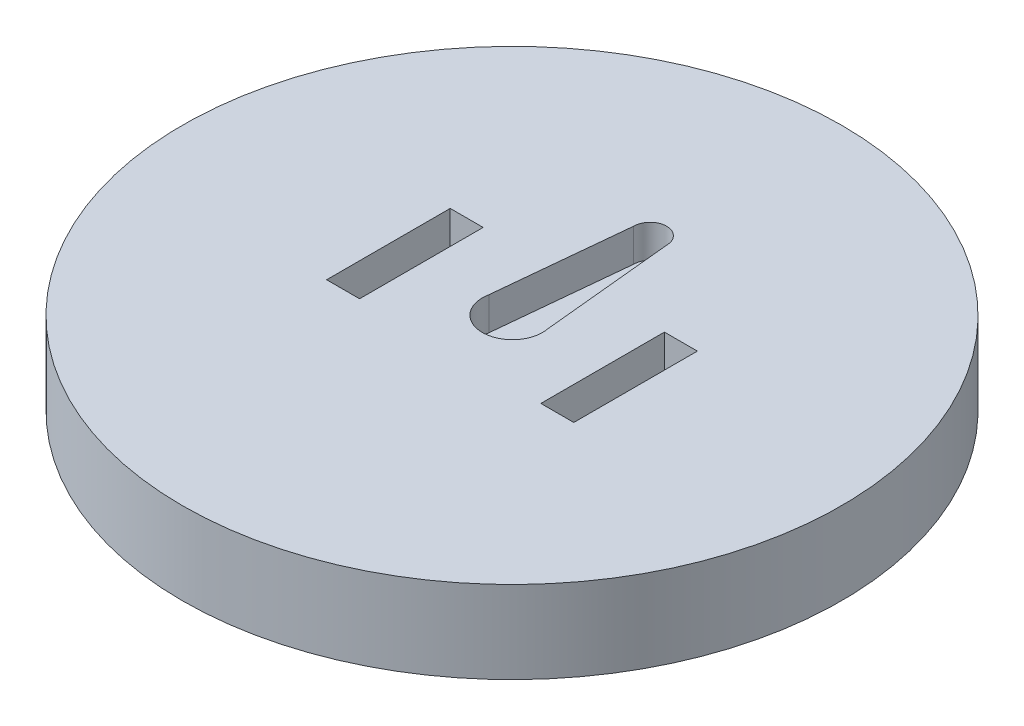
ISO-10303-21;
HEADER;
FILE_DESCRIPTION(('STEP AP214'),'2;1');
FILE_NAME('part.step','',(''),(''),'','','');
FILE_SCHEMA(('AUTOMOTIVE_DESIGN { 1 0 10303 214 1 1 1 1 }'));
ENDSEC;
DATA;
#1=APPLICATION_CONTEXT('core data for automotive mechanical design processes');
#2=APPLICATION_PROTOCOL_DEFINITION('international standard','automotive_design',2000,#1);
#3=PRODUCT_CONTEXT('',#1,'mechanical');
#4=PRODUCT('Part','Part','',(#3));
#5=PRODUCT_RELATED_PRODUCT_CATEGORY('part','',(#4));
#6=PRODUCT_DEFINITION_FORMATION('','',#4);
#7=PRODUCT_DEFINITION_CONTEXT('part definition',#1,'design');
#8=PRODUCT_DEFINITION('design','',#6,#7);
#9=PRODUCT_DEFINITION_SHAPE('','',#8);
#10=(LENGTH_UNIT() NAMED_UNIT(*) SI_UNIT(.MILLI.,.METRE.));
#11=(NAMED_UNIT(*) PLANE_ANGLE_UNIT() SI_UNIT($,.RADIAN.));
#12=(NAMED_UNIT(*) SI_UNIT($,.STERADIAN.) SOLID_ANGLE_UNIT());
#13=UNCERTAINTY_MEASURE_WITH_UNIT(LENGTH_MEASURE(1.E-05),#10,'distance_accuracy_value','');
#14=(GEOMETRIC_REPRESENTATION_CONTEXT(3) GLOBAL_UNCERTAINTY_ASSIGNED_CONTEXT((#13)) GLOBAL_UNIT_ASSIGNED_CONTEXT((#10,
#11,#12)) REPRESENTATION_CONTEXT('',''));
#15=CARTESIAN_POINT('',(0.,0.,0.));
#16=DIRECTION('',(0.,0.,1.));
#17=DIRECTION('',(1.,0.,0.));
#18=AXIS2_PLACEMENT_3D('',#15,#16,#17);
#19=CARTESIAN_POINT('',(0.,10.,0.));
#20=DIRECTION('',(0.,-1.,0.));
#21=DIRECTION('',(0.,0.,-1.));
#22=AXIS2_PLACEMENT_3D('',#19,#20,#21);
#23=CYLINDRICAL_SURFACE('',#22,40.);
#24=CARTESIAN_POINT('',(0.,10.,0.));
#25=DIRECTION('',(0.,1.,0.));
#26=DIRECTION('',(0.,0.,1.));
#27=AXIS2_PLACEMENT_3D('',#24,#25,#26);
#28=CIRCLE('',#27,40.);
#29=CARTESIAN_POINT('',(0.,10.,40.));
#30=VERTEX_POINT('',#29);
#31=EDGE_CURVE('E11',#30,#30,#28,.T.);
#32=ORIENTED_EDGE('',*,*,#31,.F.);
#33=EDGE_LOOP('',(#32));
#34=FACE_BOUND('',#33,.T.);
#35=CARTESIAN_POINT('',(0.,0.,0.));
#36=DIRECTION('',(0.,1.,0.));
#37=DIRECTION('',(0.,0.,1.));
#38=AXIS2_PLACEMENT_3D('',#35,#36,#37);
#39=CIRCLE('',#38,40.);
#40=CARTESIAN_POINT('',(0.,0.,40.));
#41=VERTEX_POINT('',#40);
#42=EDGE_CURVE('E35',#41,#41,#39,.T.);
#43=ORIENTED_EDGE('',*,*,#42,.T.);
#44=EDGE_LOOP('',(#43));
#45=FACE_BOUND('',#44,.T.);
#46=ADVANCED_FACE('F32',(#34,#45),#23,.T.);
#47=CARTESIAN_POINT('',(0.,10.,0.));
#48=DIRECTION('',(0.,1.,0.));
#49=DIRECTION('',(0.,0.,1.));
#50=AXIS2_PLACEMENT_3D('',#47,#48,#49);
#51=PLANE('',#50);
#52=DIRECTION('',(0.,0.,-1.));
#53=VECTOR('',#52,1.);
#54=CARTESIAN_POINT('',(-15.,9.99999999999995,-7.50000000000009));
#55=LINE('',#54,#53);
#56=CARTESIAN_POINT('',(-15.,10.0000000000001,7.49999999999991));
#57=VERTEX_POINT('',#56);
#58=CARTESIAN_POINT('',(-15.,9.99999999999995,-7.50000000000009));
#59=VERTEX_POINT('',#58);
#60=EDGE_CURVE('E122',#57,#59,#55,.T.);
#61=ORIENTED_EDGE('',*,*,#60,.T.);
#62=DIRECTION('',(1.,0.,0.));
#63=VECTOR('',#62,1.);
#64=CARTESIAN_POINT('',(-11.,9.99999999999995,-7.50000000000009));
#65=LINE('',#64,#63);
#66=CARTESIAN_POINT('',(-11.,10.,-7.50000000000009));
#67=VERTEX_POINT('',#66);
#68=EDGE_CURVE('E131',#59,#67,#65,.T.);
#69=ORIENTED_EDGE('',*,*,#68,.T.);
#70=DIRECTION('',(0.,0.,1.));
#71=VECTOR('',#70,1.);
#72=CARTESIAN_POINT('',(-11.,9.99999999999995,-7.50000000000009));
#73=LINE('',#72,#71);
#74=CARTESIAN_POINT('',(-11.,10.0000000000001,7.49999999999991));
#75=VERTEX_POINT('',#74);
#76=EDGE_CURVE('E46',#67,#75,#73,.T.);
#77=ORIENTED_EDGE('',*,*,#76,.T.);
#78=DIRECTION('',(-1.,0.,0.));
#79=VECTOR('',#78,1.);
#80=CARTESIAN_POINT('',(-11.,10.0000000000001,7.49999999999991));
#81=LINE('',#80,#79);
#82=EDGE_CURVE('E128',#75,#57,#81,.T.);
#83=ORIENTED_EDGE('',*,*,#82,.T.);
#84=EDGE_LOOP('',(#61,#69,#77,#83));
#85=FACE_BOUND('',#84,.T.);
#86=DIRECTION('',(1.,0.,0.));
#87=VECTOR('',#86,1.);
#88=CARTESIAN_POINT('',(11.,9.99999999999995,-7.50000000000009));
#89=LINE('',#88,#87);
#90=CARTESIAN_POINT('',(11.,9.99999999999995,-7.50000000000009));
#91=VERTEX_POINT('',#90);
#92=CARTESIAN_POINT('',(15.,9.99999999999995,-7.50000000000009));
#93=VERTEX_POINT('',#92);
#94=EDGE_CURVE('E157',#91,#93,#89,.T.);
#95=ORIENTED_EDGE('',*,*,#94,.T.);
#96=DIRECTION('',(0.,0.,1.));
#97=VECTOR('',#96,1.);
#98=CARTESIAN_POINT('',(15.,9.99999999999995,-7.50000000000009));
#99=LINE('',#98,#97);
#100=CARTESIAN_POINT('',(15.,10.,7.49999999999998));
#101=VERTEX_POINT('',#100);
#102=EDGE_CURVE('E160',#93,#101,#99,.T.);
#103=ORIENTED_EDGE('',*,*,#102,.T.);
#104=DIRECTION('',(-1.,0.,0.));
#105=VECTOR('',#104,1.);
#106=CARTESIAN_POINT('',(11.,10.0000000000001,7.49999999999991));
#107=LINE('',#106,#105);
#108=CARTESIAN_POINT('',(11.,10.0000000000001,7.49999999999991));
#109=VERTEX_POINT('',#108);
#110=EDGE_CURVE('E164',#101,#109,#107,.T.);
#111=ORIENTED_EDGE('',*,*,#110,.T.);
#112=DIRECTION('',(0.,0.,-1.));
#113=VECTOR('',#112,1.);
#114=CARTESIAN_POINT('',(11.,9.99999999999995,-7.50000000000009));
#115=LINE('',#114,#113);
#116=EDGE_CURVE('E167',#109,#91,#115,.T.);
#117=ORIENTED_EDGE('',*,*,#116,.T.);
#118=EDGE_LOOP('',(#95,#103,#111,#117));
#119=FACE_BOUND('',#118,.T.);
#120=CARTESIAN_POINT('',(0.,10.,-0.053259674199016));
#121=DIRECTION('',(0.,1.,0.));
#122=DIRECTION('',(0.,0.,1.));
#123=AXIS2_PLACEMENT_3D('',#120,#121,#122);
#124=CIRCLE('',#123,3.65);
#125=CARTESIAN_POINT('',(-3.58010378376664,10.,-0.764144262201735));
#126=VERTEX_POINT('',#125);
#127=CARTESIAN_POINT('',(3.58010378376664,10.,-0.764144262201742));
#128=VERTEX_POINT('',#127);
#129=EDGE_CURVE('E182',#126,#128,#124,.T.);
#130=ORIENTED_EDGE('',*,*,#129,.F.);
#131=DIRECTION('',(-0.0982784023819441,0.,0.995158959978381));
#132=VECTOR('',#131,1.);
#133=CARTESIAN_POINT('',(-2.00000000000001,10.,-16.7641442622017));
#134=LINE('',#133,#132);
#135=CARTESIAN_POINT('',(-2.00000000000001,10.,-16.7641442622017));
#136=VERTEX_POINT('',#135);
#137=EDGE_CURVE('E193',#136,#126,#134,.T.);
#138=ORIENTED_EDGE('',*,*,#137,.F.);
#139=CARTESIAN_POINT('',(0.,10.,-16.7641442622017));
#140=DIRECTION('',(0.,1.,0.));
#141=DIRECTION('',(0.,0.,-1.));
#142=AXIS2_PLACEMENT_3D('',#139,#140,#141);
#143=CIRCLE('',#142,2.);
#144=CARTESIAN_POINT('',(1.99999999999999,10.,-16.7641442622017));
#145=VERTEX_POINT('',#144);
#146=EDGE_CURVE('E207',#145,#136,#143,.T.);
#147=ORIENTED_EDGE('',*,*,#146,.F.);
#148=DIRECTION('',(-0.0982784023819448,0.,-0.995158959978381));
#149=VECTOR('',#148,1.);
#150=CARTESIAN_POINT('',(1.99999999999999,10.,-16.7641442622017));
#151=LINE('',#150,#149);
#152=EDGE_CURVE('E204',#128,#145,#151,.T.);
#153=ORIENTED_EDGE('',*,*,#152,.F.);
#154=EDGE_LOOP('',(#130,#138,#147,#153));
#155=FACE_BOUND('',#154,.T.);
#156=ORIENTED_EDGE('',*,*,#31,.T.);
#157=EDGE_LOOP('',(#156));
#158=FACE_BOUND('',#157,.T.);
#159=ADVANCED_FACE('F135',(#85,#119,#155,#158),#51,.T.);
#160=CARTESIAN_POINT('',(0.,0.,0.));
#161=DIRECTION('',(0.,1.,0.));
#162=DIRECTION('',(0.,0.,1.));
#163=AXIS2_PLACEMENT_3D('',#160,#161,#162);
#164=PLANE('',#163);
#165=DIRECTION('',(1.,0.,0.));
#166=VECTOR('',#165,1.);
#167=CARTESIAN_POINT('',(-11.,0.,-7.50000000000002));
#168=LINE('',#167,#166);
#169=CARTESIAN_POINT('',(-15.,0.,-7.50000000000002));
#170=VERTEX_POINT('',#169);
#171=CARTESIAN_POINT('',(-11.,0.,-7.50000000000002));
#172=VERTEX_POINT('',#171);
#173=EDGE_CURVE('E147',#170,#172,#168,.T.);
#174=ORIENTED_EDGE('',*,*,#173,.F.);
#175=DIRECTION('',(0.,0.,-1.));
#176=VECTOR('',#175,1.);
#177=CARTESIAN_POINT('',(-15.,0.,-7.50000000000002));
#178=LINE('',#177,#176);
#179=CARTESIAN_POINT('',(-15.,0.,7.49999999999998));
#180=VERTEX_POINT('',#179);
#181=EDGE_CURVE('E54',#180,#170,#178,.T.);
#182=ORIENTED_EDGE('',*,*,#181,.F.);
#183=DIRECTION('',(-1.,0.,0.));
#184=VECTOR('',#183,1.);
#185=CARTESIAN_POINT('',(-11.,0.,7.49999999999998));
#186=LINE('',#185,#184);
#187=CARTESIAN_POINT('',(-11.,0.,7.49999999999998));
#188=VERTEX_POINT('',#187);
#189=EDGE_CURVE('E138',#188,#180,#186,.T.);
#190=ORIENTED_EDGE('',*,*,#189,.F.);
#191=DIRECTION('',(0.,0.,1.));
#192=VECTOR('',#191,1.);
#193=CARTESIAN_POINT('',(-11.,0.,-7.50000000000002));
#194=LINE('',#193,#192);
#195=EDGE_CURVE('E141',#172,#188,#194,.T.);
#196=ORIENTED_EDGE('',*,*,#195,.F.);
#197=EDGE_LOOP('',(#174,#182,#190,#196));
#198=FACE_BOUND('',#197,.T.);
#199=DIRECTION('',(0.,0.,1.));
#200=VECTOR('',#199,1.);
#201=CARTESIAN_POINT('',(15.,0.,-7.50000000000002));
#202=LINE('',#201,#200);
#203=CARTESIAN_POINT('',(15.,0.,-7.50000000000009));
#204=VERTEX_POINT('',#203);
#205=CARTESIAN_POINT('',(15.,0.,7.49999999999998));
#206=VERTEX_POINT('',#205);
#207=EDGE_CURVE('E172',#204,#206,#202,.T.);
#208=ORIENTED_EDGE('',*,*,#207,.F.);
#209=DIRECTION('',(1.,0.,0.));
#210=VECTOR('',#209,1.);
#211=CARTESIAN_POINT('',(11.,0.,-7.50000000000002));
#212=LINE('',#211,#210);
#213=CARTESIAN_POINT('',(11.,0.,-7.50000000000002));
#214=VERTEX_POINT('',#213);
#215=EDGE_CURVE('E153',#214,#204,#212,.T.);
#216=ORIENTED_EDGE('',*,*,#215,.F.);
#217=DIRECTION('',(0.,0.,-1.));
#218=VECTOR('',#217,1.);
#219=CARTESIAN_POINT('',(11.,0.,-7.50000000000002));
#220=LINE('',#219,#218);
#221=CARTESIAN_POINT('',(11.,0.,7.49999999999998));
#222=VERTEX_POINT('',#221);
#223=EDGE_CURVE('E161',#222,#214,#220,.T.);
#224=ORIENTED_EDGE('',*,*,#223,.F.);
#225=DIRECTION('',(-1.,0.,0.));
#226=VECTOR('',#225,1.);
#227=CARTESIAN_POINT('',(11.,0.,7.49999999999998));
#228=LINE('',#227,#226);
#229=EDGE_CURVE('E175',#206,#222,#228,.T.);
#230=ORIENTED_EDGE('',*,*,#229,.F.);
#231=EDGE_LOOP('',(#208,#216,#224,#230));
#232=FACE_BOUND('',#231,.T.);
#233=ORIENTED_EDGE('',*,*,#42,.F.);
#234=EDGE_LOOP('',(#233));
#235=FACE_BOUND('',#234,.T.);
#236=ADVANCED_FACE('F246',(#198,#232,#235),#164,.F.);
#237=CARTESIAN_POINT('',(0.,6.,-0.053259674199016));
#238=DIRECTION('',(0.,1.,0.));
#239=DIRECTION('',(0.,0.,1.));
#240=AXIS2_PLACEMENT_3D('',#237,#238,#239);
#241=CYLINDRICAL_SURFACE('',#240,3.65);
#242=ORIENTED_EDGE('',*,*,#129,.T.);
#243=DIRECTION('',(0.,1.,0.));
#244=VECTOR('',#243,1.);
#245=CARTESIAN_POINT('',(3.58010378376664,6.,-0.764144262201742));
#246=LINE('',#245,#244);
#247=CARTESIAN_POINT('',(3.58010378376664,6.,-0.764144262201742));
#248=VERTEX_POINT('',#247);
#249=EDGE_CURVE('E202',#248,#128,#246,.T.);
#250=ORIENTED_EDGE('',*,*,#249,.F.);
#251=CARTESIAN_POINT('',(0.,6.,-0.053259674199016));
#252=DIRECTION('',(0.,1.,0.));
#253=DIRECTION('',(0.,0.,1.));
#254=AXIS2_PLACEMENT_3D('',#251,#252,#253);
#255=CIRCLE('',#254,3.65);
#256=CARTESIAN_POINT('',(-3.58010378376664,6.,-0.764144262201735));
#257=VERTEX_POINT('',#256);
#258=EDGE_CURVE('E189',#257,#248,#255,.T.);
#259=ORIENTED_EDGE('',*,*,#258,.F.);
#260=DIRECTION('',(0.,1.,0.));
#261=VECTOR('',#260,1.);
#262=CARTESIAN_POINT('',(-3.58010378376664,6.,-0.764144262201735));
#263=LINE('',#262,#261);
#264=EDGE_CURVE('E212',#257,#126,#263,.T.);
#265=ORIENTED_EDGE('',*,*,#264,.T.);
#266=EDGE_LOOP('',(#242,#250,#259,#265));
#267=FACE_BOUND('',#266,.T.);
#268=ADVANCED_FACE('F236',(#267),#241,.F.);
#269=CARTESIAN_POINT('',(-2.00000000000001,6.,-16.7641442622017));
#270=DIRECTION('',(-0.995158959978381,0.,-0.0982784023819442));
#271=DIRECTION('',(-0.0982784023819442,0.,0.995158959978381));
#272=AXIS2_PLACEMENT_3D('',#269,#270,#271);
#273=PLANE('',#272);
#274=ORIENTED_EDGE('',*,*,#137,.T.);
#275=ORIENTED_EDGE('',*,*,#264,.F.);
#276=DIRECTION('',(-0.0982784023819441,0.,0.995158959978381));
#277=VECTOR('',#276,1.);
#278=CARTESIAN_POINT('',(-2.00000000000001,6.,-16.7641442622017));
#279=LINE('',#278,#277);
#280=CARTESIAN_POINT('',(-2.00000000000001,6.,-16.7641442622017));
#281=VERTEX_POINT('',#280);
#282=EDGE_CURVE('E199',#281,#257,#279,.T.);
#283=ORIENTED_EDGE('',*,*,#282,.F.);
#284=DIRECTION('',(0.,1.,0.));
#285=VECTOR('',#284,1.);
#286=CARTESIAN_POINT('',(-2.00000000000001,6.,-16.7641442622017));
#287=LINE('',#286,#285);
#288=EDGE_CURVE('E214',#281,#136,#287,.T.);
#289=ORIENTED_EDGE('',*,*,#288,.T.);
#290=EDGE_LOOP('',(#274,#275,#283,#289));
#291=FACE_BOUND('',#290,.T.);
#292=ADVANCED_FACE('F238',(#291),#273,.F.);
#293=CARTESIAN_POINT('',(0.,6.,-16.7641442622017));
#294=DIRECTION('',(0.,1.,0.));
#295=DIRECTION('',(0.,0.,1.));
#296=AXIS2_PLACEMENT_3D('',#293,#294,#295);
#297=CYLINDRICAL_SURFACE('',#296,2.);
#298=ORIENTED_EDGE('',*,*,#146,.T.);
#299=ORIENTED_EDGE('',*,*,#288,.F.);
#300=CARTESIAN_POINT('',(0.,6.,-16.7641442622017));
#301=DIRECTION('',(0.,1.,0.));
#302=DIRECTION('',(0.,0.,-1.));
#303=AXIS2_PLACEMENT_3D('',#300,#301,#302);
#304=CIRCLE('',#303,2.);
#305=CARTESIAN_POINT('',(1.99999999999999,6.,-16.7641442622017));
#306=VERTEX_POINT('',#305);
#307=EDGE_CURVE('E196',#306,#281,#304,.T.);
#308=ORIENTED_EDGE('',*,*,#307,.F.);
#309=DIRECTION('',(0.,1.,0.));
#310=VECTOR('',#309,1.);
#311=CARTESIAN_POINT('',(1.99999999999999,6.,-16.7641442622017));
#312=LINE('',#311,#310);
#313=EDGE_CURVE('E216',#306,#145,#312,.T.);
#314=ORIENTED_EDGE('',*,*,#313,.T.);
#315=EDGE_LOOP('',(#298,#299,#308,#314));
#316=FACE_BOUND('',#315,.T.);
#317=ADVANCED_FACE('F231',(#316),#297,.F.);
#318=CARTESIAN_POINT('',(1.99999999999999,6.,-16.7641442622017));
#319=DIRECTION('',(0.995158959978381,0.,-0.0982784023819448));
#320=DIRECTION('',(-0.0982784023819448,0.,-0.995158959978381));
#321=AXIS2_PLACEMENT_3D('',#318,#319,#320);
#322=PLANE('',#321);
#323=ORIENTED_EDGE('',*,*,#152,.T.);
#324=ORIENTED_EDGE('',*,*,#313,.F.);
#325=DIRECTION('',(-0.0982784023819448,0.,-0.995158959978381));
#326=VECTOR('',#325,1.);
#327=CARTESIAN_POINT('',(1.99999999999999,6.,-16.7641442622017));
#328=LINE('',#327,#326);
#329=EDGE_CURVE('E192',#248,#306,#328,.T.);
#330=ORIENTED_EDGE('',*,*,#329,.F.);
#331=ORIENTED_EDGE('',*,*,#249,.T.);
#332=EDGE_LOOP('',(#323,#324,#330,#331));
#333=FACE_BOUND('',#332,.T.);
#334=ADVANCED_FACE('F222',(#333),#322,.F.);
#335=CARTESIAN_POINT('',(0.,6.,-0.053259674199016));
#336=DIRECTION('',(0.,1.,0.));
#337=DIRECTION('',(0.,0.,1.));
#338=AXIS2_PLACEMENT_3D('',#335,#336,#337);
#339=PLANE('',#338);
#340=ORIENTED_EDGE('',*,*,#258,.T.);
#341=ORIENTED_EDGE('',*,*,#329,.T.);
#342=ORIENTED_EDGE('',*,*,#307,.T.);
#343=ORIENTED_EDGE('',*,*,#282,.T.);
#344=EDGE_LOOP('',(#340,#341,#342,#343));
#345=FACE_BOUND('',#344,.T.);
#346=ADVANCED_FACE('F235',(#345),#339,.T.);
#347=CARTESIAN_POINT('',(11.,9.99999999999995,-7.50000000000009));
#348=DIRECTION('',(0.,0.,-1.));
#349=DIRECTION('',(0.,1.,0.));
#350=AXIS2_PLACEMENT_3D('',#347,#348,#349);
#351=PLANE('',#350);
#352=ORIENTED_EDGE('',*,*,#215,.T.);
#353=DIRECTION('',(0.,-1.,0.));
#354=VECTOR('',#353,1.);
#355=CARTESIAN_POINT('',(15.,9.99999999999995,-7.50000000000009));
#356=LINE('',#355,#354);
#357=EDGE_CURVE('E170',#93,#204,#356,.T.);
#358=ORIENTED_EDGE('',*,*,#357,.F.);
#359=ORIENTED_EDGE('',*,*,#94,.F.);
#360=DIRECTION('',(0.,-1.,0.));
#361=VECTOR('',#360,1.);
#362=CARTESIAN_POINT('',(11.,9.99999999999995,-7.50000000000009));
#363=LINE('',#362,#361);
#364=EDGE_CURVE('E180',#91,#214,#363,.T.);
#365=ORIENTED_EDGE('',*,*,#364,.T.);
#366=EDGE_LOOP('',(#352,#358,#359,#365));
#367=FACE_BOUND('',#366,.T.);
#368=ADVANCED_FACE('F270',(#367),#351,.F.);
#369=CARTESIAN_POINT('',(11.,9.99999999999995,-7.50000000000009));
#370=DIRECTION('',(-1.,0.,0.));
#371=DIRECTION('',(0.,0.,1.));
#372=AXIS2_PLACEMENT_3D('',#369,#370,#371);
#373=PLANE('',#372);
#374=ORIENTED_EDGE('',*,*,#223,.T.);
#375=ORIENTED_EDGE('',*,*,#364,.F.);
#376=ORIENTED_EDGE('',*,*,#116,.F.);
#377=DIRECTION('',(0.,-1.,0.));
#378=VECTOR('',#377,1.);
#379=CARTESIAN_POINT('',(11.,10.0000000000001,7.49999999999991));
#380=LINE('',#379,#378);
#381=EDGE_CURVE('E183',#109,#222,#380,.T.);
#382=ORIENTED_EDGE('',*,*,#381,.T.);
#383=EDGE_LOOP('',(#374,#375,#376,#382));
#384=FACE_BOUND('',#383,.T.);
#385=ADVANCED_FACE('F274',(#384),#373,.F.);
#386=CARTESIAN_POINT('',(11.,10.0000000000001,7.49999999999991));
#387=DIRECTION('',(0.,0.,1.));
#388=DIRECTION('',(0.,-1.,0.));
#389=AXIS2_PLACEMENT_3D('',#386,#387,#388);
#390=PLANE('',#389);
#391=ORIENTED_EDGE('',*,*,#229,.T.);
#392=ORIENTED_EDGE('',*,*,#381,.F.);
#393=ORIENTED_EDGE('',*,*,#110,.F.);
#394=DIRECTION('',(0.,-1.,0.));
#395=VECTOR('',#394,1.);
#396=CARTESIAN_POINT('',(15.,10.0000000000001,7.49999999999991));
#397=LINE('',#396,#395);
#398=EDGE_CURVE('E185',#101,#206,#397,.T.);
#399=ORIENTED_EDGE('',*,*,#398,.T.);
#400=EDGE_LOOP('',(#391,#392,#393,#399));
#401=FACE_BOUND('',#400,.T.);
#402=ADVANCED_FACE('F281',(#401),#390,.F.);
#403=CARTESIAN_POINT('',(15.,9.99999999999995,-7.50000000000009));
#404=DIRECTION('',(1.,0.,0.));
#405=DIRECTION('',(0.,0.,-1.));
#406=AXIS2_PLACEMENT_3D('',#403,#404,#405);
#407=PLANE('',#406);
#408=ORIENTED_EDGE('',*,*,#207,.T.);
#409=ORIENTED_EDGE('',*,*,#398,.F.);
#410=ORIENTED_EDGE('',*,*,#102,.F.);
#411=ORIENTED_EDGE('',*,*,#357,.T.);
#412=EDGE_LOOP('',(#408,#409,#410,#411));
#413=FACE_BOUND('',#412,.T.);
#414=ADVANCED_FACE('F278',(#413),#407,.F.);
#415=CARTESIAN_POINT('',(-15.,9.99999999999995,-7.50000000000009));
#416=DIRECTION('',(-1.,0.,0.));
#417=DIRECTION('',(0.,0.,1.));
#418=AXIS2_PLACEMENT_3D('',#415,#416,#417);
#419=PLANE('',#418);
#420=ORIENTED_EDGE('',*,*,#181,.T.);
#421=DIRECTION('',(0.,-1.,0.));
#422=VECTOR('',#421,1.);
#423=CARTESIAN_POINT('',(-15.,9.99999999999995,-7.50000000000009));
#424=LINE('',#423,#422);
#425=EDGE_CURVE('E118',#59,#170,#424,.T.);
#426=ORIENTED_EDGE('',*,*,#425,.F.);
#427=ORIENTED_EDGE('',*,*,#60,.F.);
#428=DIRECTION('',(0.,-1.,0.));
#429=VECTOR('',#428,1.);
#430=CARTESIAN_POINT('',(-15.,10.0000000000001,7.49999999999991));
#431=LINE('',#430,#429);
#432=EDGE_CURVE('E151',#57,#180,#431,.T.);
#433=ORIENTED_EDGE('',*,*,#432,.T.);
#434=EDGE_LOOP('',(#420,#426,#427,#433));
#435=FACE_BOUND('',#434,.T.);
#436=ADVANCED_FACE('F120',(#435),#419,.F.);
#437=CARTESIAN_POINT('',(-11.,10.0000000000001,7.49999999999991));
#438=DIRECTION('',(0.,0.,1.));
#439=DIRECTION('',(0.,-1.,0.));
#440=AXIS2_PLACEMENT_3D('',#437,#438,#439);
#441=PLANE('',#440);
#442=ORIENTED_EDGE('',*,*,#189,.T.);
#443=ORIENTED_EDGE('',*,*,#432,.F.);
#444=ORIENTED_EDGE('',*,*,#82,.F.);
#445=DIRECTION('',(0.,-1.,0.));
#446=VECTOR('',#445,1.);
#447=CARTESIAN_POINT('',(-11.,10.0000000000001,7.49999999999991));
#448=LINE('',#447,#446);
#449=EDGE_CURVE('E154',#75,#188,#448,.T.);
#450=ORIENTED_EDGE('',*,*,#449,.T.);
#451=EDGE_LOOP('',(#442,#443,#444,#450));
#452=FACE_BOUND('',#451,.T.);
#453=ADVANCED_FACE('F291',(#452),#441,.F.);
#454=CARTESIAN_POINT('',(-11.,9.99999999999995,-7.50000000000009));
#455=DIRECTION('',(1.,0.,0.));
#456=DIRECTION('',(0.,0.,-1.));
#457=AXIS2_PLACEMENT_3D('',#454,#455,#456);
#458=PLANE('',#457);
#459=ORIENTED_EDGE('',*,*,#195,.T.);
#460=ORIENTED_EDGE('',*,*,#449,.F.);
#461=ORIENTED_EDGE('',*,*,#76,.F.);
#462=DIRECTION('',(0.,-1.,0.));
#463=VECTOR('',#462,1.);
#464=CARTESIAN_POINT('',(-11.,9.99999999999995,-7.50000000000009));
#465=LINE('',#464,#463);
#466=EDGE_CURVE('E127',#67,#172,#465,.T.);
#467=ORIENTED_EDGE('',*,*,#466,.T.);
#468=EDGE_LOOP('',(#459,#460,#461,#467));
#469=FACE_BOUND('',#468,.T.);
#470=ADVANCED_FACE('F294',(#469),#458,.F.);
#471=CARTESIAN_POINT('',(-11.,9.99999999999995,-7.50000000000009));
#472=DIRECTION('',(0.,0.,-1.));
#473=DIRECTION('',(0.,1.,0.));
#474=AXIS2_PLACEMENT_3D('',#471,#472,#473);
#475=PLANE('',#474);
#476=ORIENTED_EDGE('',*,*,#173,.T.);
#477=ORIENTED_EDGE('',*,*,#466,.F.);
#478=ORIENTED_EDGE('',*,*,#68,.F.);
#479=ORIENTED_EDGE('',*,*,#425,.T.);
#480=EDGE_LOOP('',(#476,#477,#478,#479));
#481=FACE_BOUND('',#480,.T.);
#482=ADVANCED_FACE('F132',(#481),#475,.F.);
#483=CLOSED_SHELL('',(#46,#159,#236,#268,#292,#317,#334,#346,#368,#385,#402,#414,#436,#453,#470,#482));
#484=MANIFOLD_SOLID_BREP('B2',#483);
#485=ADVANCED_BREP_SHAPE_REPRESENTATION('',(#18,#484),#14);
#486=SHAPE_DEFINITION_REPRESENTATION(#9,#485);
ENDSEC;
END-ISO-10303-21;
